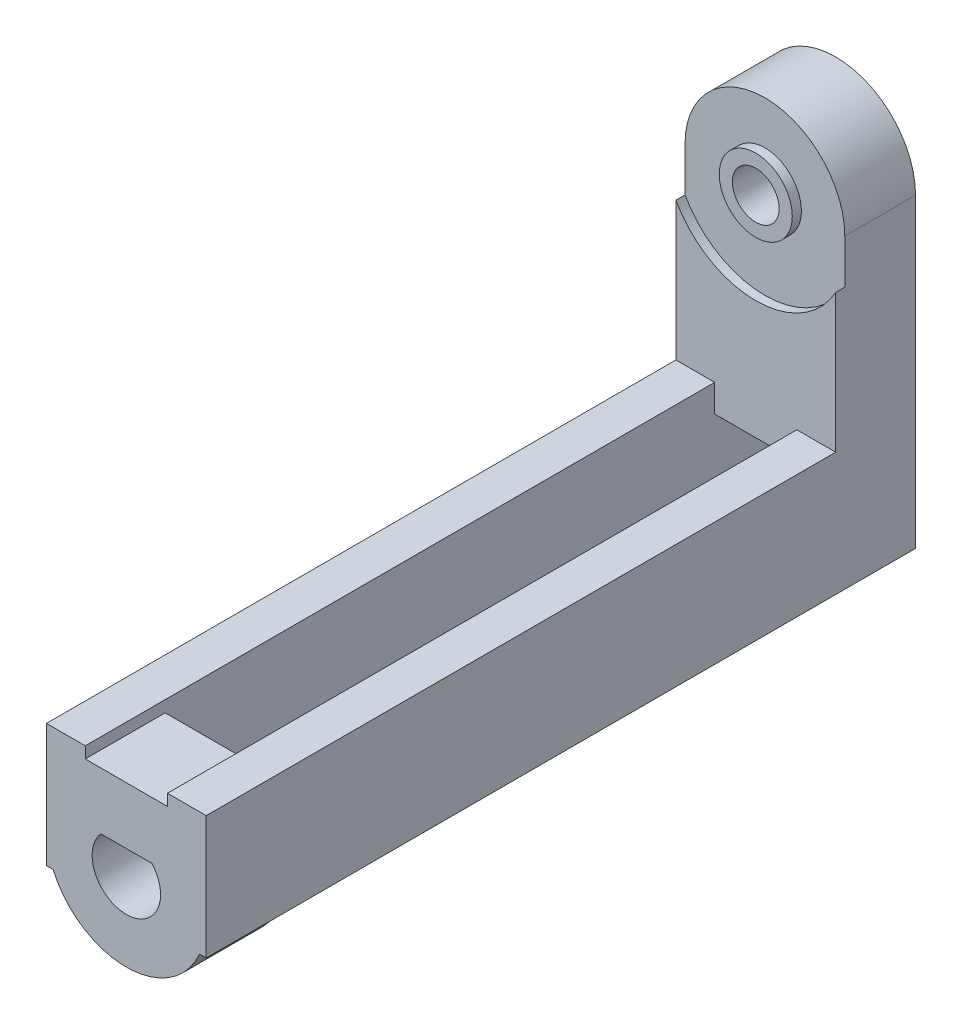
ISO-10303-21;
HEADER;
FILE_DESCRIPTION(('STEP AP214'),'2;1');
FILE_NAME('part.step','',(''),(''),'','','');
FILE_SCHEMA(('AUTOMOTIVE_DESIGN { 1 0 10303 214 1 1 1 1 }'));
ENDSEC;
DATA;
#1=APPLICATION_CONTEXT('core data for automotive mechanical design processes');
#2=APPLICATION_PROTOCOL_DEFINITION('international standard','automotive_design',2000,#1);
#3=PRODUCT_CONTEXT('',#1,'mechanical');
#4=PRODUCT('Part','Part','',(#3));
#5=PRODUCT_RELATED_PRODUCT_CATEGORY('part','',(#4));
#6=PRODUCT_DEFINITION_FORMATION('','',#4);
#7=PRODUCT_DEFINITION_CONTEXT('part definition',#1,'design');
#8=PRODUCT_DEFINITION('design','',#6,#7);
#9=PRODUCT_DEFINITION_SHAPE('','',#8);
#10=(LENGTH_UNIT() NAMED_UNIT(*) SI_UNIT(.MILLI.,.METRE.));
#11=(NAMED_UNIT(*) PLANE_ANGLE_UNIT() SI_UNIT($,.RADIAN.));
#12=(NAMED_UNIT(*) SI_UNIT($,.STERADIAN.) SOLID_ANGLE_UNIT());
#13=UNCERTAINTY_MEASURE_WITH_UNIT(LENGTH_MEASURE(1.E-05),#10,'distance_accuracy_value','');
#14=(GEOMETRIC_REPRESENTATION_CONTEXT(3) GLOBAL_UNCERTAINTY_ASSIGNED_CONTEXT((#13)) GLOBAL_UNIT_ASSIGNED_CONTEXT((#10,
#11,#12)) REPRESENTATION_CONTEXT('',''));
#15=CARTESIAN_POINT('',(0.,0.,0.));
#16=DIRECTION('',(0.,0.,1.));
#17=DIRECTION('',(1.,0.,0.));
#18=AXIS2_PLACEMENT_3D('',#15,#16,#17);
#19=CARTESIAN_POINT('',(0.,0.,-24.075));
#20=DIRECTION('',(0.,0.,-1.));
#21=DIRECTION('',(-1.,0.,0.));
#22=AXIS2_PLACEMENT_3D('',#19,#20,#21);
#23=PLANE('',#22);
#24=CARTESIAN_POINT('',(0.,12.,-24.075));
#25=DIRECTION('',(0.,0.,1.));
#26=DIRECTION('',(1.,0.,0.));
#27=AXIS2_PLACEMENT_3D('',#24,#25,#26);
#28=CIRCLE('',#27,4.);
#29=CARTESIAN_POINT('',(-3.5,10.0635083268963,-24.075));
#30=VERTEX_POINT('',#29);
#31=CARTESIAN_POINT('',(3.5,10.0635083268963,-24.075));
#32=VERTEX_POINT('',#31);
#33=EDGE_CURVE('E188',#30,#32,#28,.T.);
#34=ORIENTED_EDGE('',*,*,#33,.F.);
#35=DIRECTION('',(0.,-1.,0.));
#36=VECTOR('',#35,1.);
#37=CARTESIAN_POINT('',(-3.5,2.8,-24.075));
#38=LINE('',#37,#36);
#39=CARTESIAN_POINT('',(-3.5,4.,-24.075));
#40=VERTEX_POINT('',#39);
#41=EDGE_CURVE('E200',#30,#40,#38,.T.);
#42=ORIENTED_EDGE('',*,*,#41,.T.);
#43=DIRECTION('',(1.,0.,0.));
#44=VECTOR('',#43,1.);
#45=CARTESIAN_POINT('',(-3.5,4.,-24.075));
#46=LINE('',#45,#44);
#47=CARTESIAN_POINT('',(-1.8,4.,-24.075));
#48=VERTEX_POINT('',#47);
#49=EDGE_CURVE('E230',#40,#48,#46,.T.);
#50=ORIENTED_EDGE('',*,*,#49,.T.);
#51=DIRECTION('',(0.,-1.,0.));
#52=VECTOR('',#51,1.);
#53=CARTESIAN_POINT('',(-1.8,-1.4,-24.075));
#54=LINE('',#53,#52);
#55=CARTESIAN_POINT('',(-1.8,2.8,-24.075));
#56=VERTEX_POINT('',#55);
#57=EDGE_CURVE('E227',#48,#56,#54,.T.);
#58=ORIENTED_EDGE('',*,*,#57,.T.);
#59=DIRECTION('',(1.,0.,0.));
#60=VECTOR('',#59,1.);
#61=CARTESIAN_POINT('',(-3.5,2.8,-24.075));
#62=LINE('',#61,#60);
#63=CARTESIAN_POINT('',(1.8,2.8,-24.075));
#64=VERTEX_POINT('',#63);
#65=EDGE_CURVE('E209',#56,#64,#62,.T.);
#66=ORIENTED_EDGE('',*,*,#65,.T.);
#67=DIRECTION('',(0.,1.,0.));
#68=VECTOR('',#67,1.);
#69=CARTESIAN_POINT('',(1.8,-1.4,-24.075));
#70=LINE('',#69,#68);
#71=CARTESIAN_POINT('',(1.8,4.,-24.075));
#72=VERTEX_POINT('',#71);
#73=EDGE_CURVE('E224',#64,#72,#70,.T.);
#74=ORIENTED_EDGE('',*,*,#73,.T.);
#75=DIRECTION('',(1.,0.,0.));
#76=VECTOR('',#75,1.);
#77=CARTESIAN_POINT('',(1.8,4.,-24.075));
#78=LINE('',#77,#76);
#79=CARTESIAN_POINT('',(3.5,4.,-24.075));
#80=VERTEX_POINT('',#79);
#81=EDGE_CURVE('E338',#72,#80,#78,.T.);
#82=ORIENTED_EDGE('',*,*,#81,.T.);
#83=DIRECTION('',(0.,1.,0.));
#84=VECTOR('',#83,1.);
#85=CARTESIAN_POINT('',(3.5,2.8,-24.075));
#86=LINE('',#85,#84);
#87=EDGE_CURVE('E201',#80,#32,#86,.T.);
#88=ORIENTED_EDGE('',*,*,#87,.T.);
#89=EDGE_LOOP('',(#34,#42,#50,#58,#66,#74,#82,#88));
#90=FACE_BOUND('',#89,.T.);
#91=ADVANCED_FACE('F39',(#90),#23,.F.);
#92=CARTESIAN_POINT('',(0.,12.,-24.075));
#93=DIRECTION('',(0.,0.,1.));
#94=DIRECTION('',(1.,0.,0.));
#95=AXIS2_PLACEMENT_3D('',#92,#93,#94);
#96=CIRCLE('',#95,1.025);
#97=CARTESIAN_POINT('',(1.025,12.,-24.075));
#98=VERTEX_POINT('',#97);
#99=EDGE_CURVE('E473',#98,#98,#96,.T.);
#100=ORIENTED_EDGE('',*,*,#99,.F.);
#101=EDGE_LOOP('',(#100));
#102=FACE_BOUND('',#101,.T.);
#103=CARTESIAN_POINT('',(0.,12.,-24.075));
#104=DIRECTION('',(0.,0.,1.));
#105=DIRECTION('',(1.,0.,0.));
#106=AXIS2_PLACEMENT_3D('',#103,#104,#105);
#107=CIRCLE('',#106,1.6);
#108=CARTESIAN_POINT('',(1.6,12.,-24.075));
#109=VERTEX_POINT('',#108);
#110=EDGE_CURVE('E480',#109,#109,#107,.T.);
#111=ORIENTED_EDGE('',*,*,#110,.T.);
#112=EDGE_LOOP('',(#111));
#113=FACE_BOUND('',#112,.T.);
#114=ADVANCED_FACE('F401',(#102,#113),#23,.F.);
#115=CARTESIAN_POINT('',(0.,12.,-24.075));
#116=DIRECTION('',(0.,0.,-1.));
#117=DIRECTION('',(-1.,0.,0.));
#118=AXIS2_PLACEMENT_3D('',#115,#116,#117);
#119=CYLINDRICAL_SURFACE('',#118,3.5);
#120=CARTESIAN_POINT('',(0.,12.,-24.475));
#121=DIRECTION('',(0.,0.,1.));
#122=DIRECTION('',(1.,0.,0.));
#123=AXIS2_PLACEMENT_3D('',#120,#121,#122);
#124=CIRCLE('',#123,3.5);
#125=CARTESIAN_POINT('',(3.5,12.,-24.475));
#126=VERTEX_POINT('',#125);
#127=CARTESIAN_POINT('',(-3.5,12.,-24.475));
#128=VERTEX_POINT('',#127);
#129=EDGE_CURVE('E11',#126,#128,#124,.T.);
#130=ORIENTED_EDGE('',*,*,#129,.F.);
#131=DIRECTION('',(0.,0.,-1.));
#132=VECTOR('',#131,1.);
#133=CARTESIAN_POINT('',(3.5,12.,-24.075));
#134=LINE('',#133,#132);
#135=CARTESIAN_POINT('',(3.5,12.,-27.575));
#136=VERTEX_POINT('',#135);
#137=EDGE_CURVE('E225',#126,#136,#134,.T.);
#138=ORIENTED_EDGE('',*,*,#137,.T.);
#139=CARTESIAN_POINT('',(0.,12.,-27.575));
#140=DIRECTION('',(0.,0.,1.));
#141=DIRECTION('',(1.,0.,0.));
#142=AXIS2_PLACEMENT_3D('',#139,#140,#141);
#143=CIRCLE('',#142,3.5);
#144=CARTESIAN_POINT('',(-3.5,12.,-27.575));
#145=VERTEX_POINT('',#144);
#146=EDGE_CURVE('E211',#136,#145,#143,.T.);
#147=ORIENTED_EDGE('',*,*,#146,.T.);
#148=DIRECTION('',(0.,0.,-1.));
#149=VECTOR('',#148,1.);
#150=CARTESIAN_POINT('',(-3.5,12.,-24.075));
#151=LINE('',#150,#149);
#152=EDGE_CURVE('E219',#128,#145,#151,.T.);
#153=ORIENTED_EDGE('',*,*,#152,.F.);
#154=EDGE_LOOP('',(#130,#138,#147,#153));
#155=FACE_BOUND('',#154,.T.);
#156=ADVANCED_FACE('F386',(#155),#119,.T.);
#157=CARTESIAN_POINT('',(-1.8,-1.4,3.5));
#158=DIRECTION('',(-1.,0.,0.));
#159=DIRECTION('',(0.,0.,1.));
#160=AXIS2_PLACEMENT_3D('',#157,#158,#159);
#161=PLANE('',#160);
#162=DIRECTION('',(0.,0.,-1.));
#163=VECTOR('',#162,1.);
#164=CARTESIAN_POINT('',(-1.8,2.8,3.5));
#165=LINE('',#164,#163);
#166=CARTESIAN_POINT('',(-1.8,2.8,-27.575));
#167=VERTEX_POINT('',#166);
#168=EDGE_CURVE('E235',#56,#167,#165,.T.);
#169=ORIENTED_EDGE('',*,*,#168,.F.);
#170=ORIENTED_EDGE('',*,*,#57,.F.);
#171=DIRECTION('',(0.,0.,-1.));
#172=VECTOR('',#171,1.);
#173=CARTESIAN_POINT('',(-1.8,4.,3.5));
#174=LINE('',#173,#172);
#175=CARTESIAN_POINT('',(-1.8,4.,3.5));
#176=VERTEX_POINT('',#175);
#177=EDGE_CURVE('E286',#176,#48,#174,.T.);
#178=ORIENTED_EDGE('',*,*,#177,.F.);
#179=DIRECTION('',(0.,1.,0.));
#180=VECTOR('',#179,1.);
#181=CARTESIAN_POINT('',(-1.8,-1.4,3.5));
#182=LINE('',#181,#180);
#183=CARTESIAN_POINT('',(-1.8,3.5,3.5));
#184=VERTEX_POINT('',#183);
#185=EDGE_CURVE('E277',#184,#176,#182,.T.);
#186=ORIENTED_EDGE('',*,*,#185,.F.);
#187=DIRECTION('',(0.,0.,-1.));
#188=VECTOR('',#187,1.);
#189=CARTESIAN_POINT('',(-1.8,3.5,-1.2E-05));
#190=LINE('',#189,#188);
#191=CARTESIAN_POINT('',(-1.8,3.5,0.));
#192=VERTEX_POINT('',#191);
#193=EDGE_CURVE('E329',#184,#192,#190,.T.);
#194=ORIENTED_EDGE('',*,*,#193,.T.);
#195=DIRECTION('',(0.,-1.,0.));
#196=VECTOR('',#195,1.);
#197=CARTESIAN_POINT('',(-1.8,12.,0.));
#198=LINE('',#197,#196);
#199=CARTESIAN_POINT('',(-1.8,-1.4,0.));
#200=VERTEX_POINT('',#199);
#201=EDGE_CURVE('E298',#192,#200,#198,.T.);
#202=ORIENTED_EDGE('',*,*,#201,.T.);
#203=DIRECTION('',(0.,0.,-1.));
#204=VECTOR('',#203,1.);
#205=CARTESIAN_POINT('',(-1.8,-1.4,3.5));
#206=LINE('',#205,#204);
#207=CARTESIAN_POINT('',(-1.8,-1.4,-27.575));
#208=VERTEX_POINT('',#207);
#209=EDGE_CURVE('E292',#200,#208,#206,.T.);
#210=ORIENTED_EDGE('',*,*,#209,.T.);
#211=DIRECTION('',(0.,1.,0.));
#212=VECTOR('',#211,1.);
#213=CARTESIAN_POINT('',(-1.8,-1.4,-27.575));
#214=LINE('',#213,#212);
#215=EDGE_CURVE('E274',#208,#167,#214,.T.);
#216=ORIENTED_EDGE('',*,*,#215,.T.);
#217=EDGE_LOOP('',(#169,#170,#178,#186,#194,#202,#210,#216));
#218=FACE_BOUND('',#217,.T.);
#219=ADVANCED_FACE('F397',(#218),#161,.F.);
#220=CARTESIAN_POINT('',(-3.5,4.,3.5));
#221=DIRECTION('',(0.,-1.,0.));
#222=DIRECTION('',(0.,0.,-1.));
#223=AXIS2_PLACEMENT_3D('',#220,#221,#222);
#224=PLANE('',#223);
#225=ORIENTED_EDGE('',*,*,#49,.F.);
#226=DIRECTION('',(0.,0.,-1.));
#227=VECTOR('',#226,1.);
#228=CARTESIAN_POINT('',(-3.5,4.,3.5));
#229=LINE('',#228,#227);
#230=CARTESIAN_POINT('',(-3.5,4.,3.5));
#231=VERTEX_POINT('',#230);
#232=EDGE_CURVE('E210',#231,#40,#229,.T.);
#233=ORIENTED_EDGE('',*,*,#232,.F.);
#234=DIRECTION('',(-1.,0.,0.));
#235=VECTOR('',#234,1.);
#236=CARTESIAN_POINT('',(-3.5,4.,3.5));
#237=LINE('',#236,#235);
#238=EDGE_CURVE('E279',#176,#231,#237,.T.);
#239=ORIENTED_EDGE('',*,*,#238,.F.);
#240=ORIENTED_EDGE('',*,*,#177,.T.);
#241=EDGE_LOOP('',(#225,#233,#239,#240));
#242=FACE_BOUND('',#241,.T.);
#243=ADVANCED_FACE('F358',(#242),#224,.F.);
#244=CARTESIAN_POINT('',(1.8,-1.4,3.5));
#245=DIRECTION('',(1.,0.,0.));
#246=DIRECTION('',(0.,0.,-1.));
#247=AXIS2_PLACEMENT_3D('',#244,#245,#246);
#248=PLANE('',#247);
#249=DIRECTION('',(0.,0.,1.));
#250=VECTOR('',#249,1.);
#251=CARTESIAN_POINT('',(1.8,2.8,3.5));
#252=LINE('',#251,#250);
#253=CARTESIAN_POINT('',(1.8,2.8,-27.575));
#254=VERTEX_POINT('',#253);
#255=EDGE_CURVE('E50',#254,#64,#252,.T.);
#256=ORIENTED_EDGE('',*,*,#255,.F.);
#257=DIRECTION('',(0.,-1.,0.));
#258=VECTOR('',#257,1.);
#259=CARTESIAN_POINT('',(1.8,-1.4,-27.575));
#260=LINE('',#259,#258);
#261=CARTESIAN_POINT('',(1.8,-1.4,-27.575));
#262=VERTEX_POINT('',#261);
#263=EDGE_CURVE('E233',#254,#262,#260,.T.);
#264=ORIENTED_EDGE('',*,*,#263,.T.);
#265=DIRECTION('',(0.,0.,-1.));
#266=VECTOR('',#265,1.);
#267=CARTESIAN_POINT('',(1.8,-1.4,3.5));
#268=LINE('',#267,#266);
#269=CARTESIAN_POINT('',(1.8,-1.4,0.));
#270=VERTEX_POINT('',#269);
#271=EDGE_CURVE('E259',#270,#262,#268,.T.);
#272=ORIENTED_EDGE('',*,*,#271,.F.);
#273=DIRECTION('',(0.,1.,0.));
#274=VECTOR('',#273,1.);
#275=CARTESIAN_POINT('',(1.8,12.,0.));
#276=LINE('',#275,#274);
#277=CARTESIAN_POINT('',(1.8,3.5,0.));
#278=VERTEX_POINT('',#277);
#279=EDGE_CURVE('E267',#270,#278,#276,.T.);
#280=ORIENTED_EDGE('',*,*,#279,.T.);
#281=DIRECTION('',(0.,0.,1.));
#282=VECTOR('',#281,1.);
#283=CARTESIAN_POINT('',(1.8,3.5,-1.2E-05));
#284=LINE('',#283,#282);
#285=CARTESIAN_POINT('',(1.8,3.5,3.5));
#286=VERTEX_POINT('',#285);
#287=EDGE_CURVE('E270',#278,#286,#284,.T.);
#288=ORIENTED_EDGE('',*,*,#287,.T.);
#289=DIRECTION('',(0.,-1.,0.));
#290=VECTOR('',#289,1.);
#291=CARTESIAN_POINT('',(1.8,-1.4,3.5));
#292=LINE('',#291,#290);
#293=CARTESIAN_POINT('',(1.8,4.,3.5));
#294=VERTEX_POINT('',#293);
#295=EDGE_CURVE('E237',#294,#286,#292,.T.);
#296=ORIENTED_EDGE('',*,*,#295,.F.);
#297=DIRECTION('',(0.,0.,-1.));
#298=VECTOR('',#297,1.);
#299=CARTESIAN_POINT('',(1.8,4.,3.5));
#300=LINE('',#299,#298);
#301=EDGE_CURVE('E250',#294,#72,#300,.T.);
#302=ORIENTED_EDGE('',*,*,#301,.T.);
#303=ORIENTED_EDGE('',*,*,#73,.F.);
#304=EDGE_LOOP('',(#256,#264,#272,#280,#288,#296,#302,#303));
#305=FACE_BOUND('',#304,.T.);
#306=ADVANCED_FACE('F359',(#305),#248,.F.);
#307=CARTESIAN_POINT('',(1.8,4.,3.5));
#308=DIRECTION('',(0.,-1.,0.));
#309=DIRECTION('',(0.,0.,-1.));
#310=AXIS2_PLACEMENT_3D('',#307,#308,#309);
#311=PLANE('',#310);
#312=ORIENTED_EDGE('',*,*,#81,.F.);
#313=ORIENTED_EDGE('',*,*,#301,.F.);
#314=DIRECTION('',(-1.,0.,0.));
#315=VECTOR('',#314,1.);
#316=CARTESIAN_POINT('',(1.8,4.,3.5));
#317=LINE('',#316,#315);
#318=CARTESIAN_POINT('',(3.5,4.,3.5));
#319=VERTEX_POINT('',#318);
#320=EDGE_CURVE('E241',#319,#294,#317,.T.);
#321=ORIENTED_EDGE('',*,*,#320,.F.);
#322=DIRECTION('',(0.,0.,-1.));
#323=VECTOR('',#322,1.);
#324=CARTESIAN_POINT('',(3.5,4.,3.5));
#325=LINE('',#324,#323);
#326=EDGE_CURVE('E254',#319,#80,#325,.T.);
#327=ORIENTED_EDGE('',*,*,#326,.T.);
#328=EDGE_LOOP('',(#312,#313,#321,#327));
#329=FACE_BOUND('',#328,.T.);
#330=ADVANCED_FACE('F410',(#329),#311,.F.);
#331=CARTESIAN_POINT('',(0.,0.,3.5));
#332=DIRECTION('',(0.,0.,-1.));
#333=DIRECTION('',(-1.,0.,0.));
#334=AXIS2_PLACEMENT_3D('',#331,#332,#333);
#335=CYLINDRICAL_SURFACE('',#334,3.5);
#336=DIRECTION('',(0.,0.,-1.));
#337=VECTOR('',#336,1.);
#338=CARTESIAN_POINT('',(3.20780298646909,-1.4,3.5));
#339=LINE('',#338,#337);
#340=CARTESIAN_POINT('',(3.20780298646909,-1.4,3.5));
#341=VERTEX_POINT('',#340);
#342=CARTESIAN_POINT('',(3.20780298646909,-1.4,0.));
#343=VERTEX_POINT('',#342);
#344=EDGE_CURVE('E262',#341,#343,#339,.T.);
#345=ORIENTED_EDGE('',*,*,#344,.F.);
#346=CARTESIAN_POINT('',(0.,0.,3.5));
#347=DIRECTION('',(0.,0.,1.));
#348=DIRECTION('',(1.,0.,0.));
#349=AXIS2_PLACEMENT_3D('',#346,#347,#348);
#350=CIRCLE('',#349,3.5);
#351=CARTESIAN_POINT('',(-3.20780298646909,-1.4,3.5));
#352=VERTEX_POINT('',#351);
#353=EDGE_CURVE('E325',#352,#341,#350,.T.);
#354=ORIENTED_EDGE('',*,*,#353,.F.);
#355=DIRECTION('',(0.,0.,-1.));
#356=VECTOR('',#355,1.);
#357=CARTESIAN_POINT('',(-3.20780298646909,-1.4,3.5));
#358=LINE('',#357,#356);
#359=CARTESIAN_POINT('',(-3.20780298646909,-1.4,0.));
#360=VERTEX_POINT('',#359);
#361=EDGE_CURVE('E299',#360,#352,#358,.F.);
#362=ORIENTED_EDGE('',*,*,#361,.F.);
#363=CARTESIAN_POINT('',(0.,0.,0.));
#364=DIRECTION('',(0.,0.,1.));
#365=DIRECTION('',(1.,0.,0.));
#366=AXIS2_PLACEMENT_3D('',#363,#364,#365);
#367=CIRCLE('',#366,3.5);
#368=EDGE_CURVE('E320',#360,#343,#367,.T.);
#369=ORIENTED_EDGE('',*,*,#368,.T.);
#370=EDGE_LOOP('',(#345,#354,#362,#369));
#371=FACE_BOUND('',#370,.T.);
#372=ADVANCED_FACE('F41',(#371),#335,.T.);
#373=CARTESIAN_POINT('',(0.,12.,0.));
#374=DIRECTION('',(0.,0.,1.));
#375=DIRECTION('',(1.,0.,0.));
#376=AXIS2_PLACEMENT_3D('',#373,#374,#375);
#377=PLANE('',#376);
#378=DIRECTION('',(-1.,0.,0.));
#379=VECTOR('',#378,1.);
#380=CARTESIAN_POINT('',(-1.1180339887499,1.,0.));
#381=LINE('',#380,#379);
#382=CARTESIAN_POINT('',(1.1180339887499,1.,0.));
#383=VERTEX_POINT('',#382);
#384=CARTESIAN_POINT('',(-1.1180339887499,0.999999999999999,0.));
#385=VERTEX_POINT('',#384);
#386=EDGE_CURVE('E309',#383,#385,#381,.T.);
#387=ORIENTED_EDGE('',*,*,#386,.T.);
#388=CARTESIAN_POINT('',(0.,0.,0.));
#389=DIRECTION('',(0.,0.,1.));
#390=DIRECTION('',(1.,0.,0.));
#391=AXIS2_PLACEMENT_3D('',#388,#389,#390);
#392=CIRCLE('',#391,1.5);
#393=EDGE_CURVE('E313',#385,#383,#392,.T.);
#394=ORIENTED_EDGE('',*,*,#393,.T.);
#395=EDGE_LOOP('',(#387,#394));
#396=FACE_BOUND('',#395,.T.);
#397=ORIENTED_EDGE('',*,*,#279,.F.);
#398=DIRECTION('',(-1.,0.,0.));
#399=VECTOR('',#398,1.);
#400=CARTESIAN_POINT('',(0.,-1.4,0.));
#401=LINE('',#400,#399);
#402=EDGE_CURVE('E261',#343,#270,#401,.T.);
#403=ORIENTED_EDGE('',*,*,#402,.F.);
#404=ORIENTED_EDGE('',*,*,#368,.F.);
#405=DIRECTION('',(-1.,0.,0.));
#406=VECTOR('',#405,1.);
#407=CARTESIAN_POINT('',(0.,-1.4,0.));
#408=LINE('',#407,#406);
#409=EDGE_CURVE('E331',#200,#360,#408,.T.);
#410=ORIENTED_EDGE('',*,*,#409,.F.);
#411=ORIENTED_EDGE('',*,*,#201,.F.);
#412=DIRECTION('',(1.,0.,0.));
#413=VECTOR('',#412,1.);
#414=CARTESIAN_POINT('',(0.,3.5,0.));
#415=LINE('',#414,#413);
#416=EDGE_CURVE('E322',#192,#278,#415,.T.);
#417=ORIENTED_EDGE('',*,*,#416,.T.);
#418=EDGE_LOOP('',(#397,#403,#404,#410,#411,#417));
#419=FACE_BOUND('',#418,.T.);
#420=ADVANCED_FACE('F450',(#396,#419),#377,.F.);
#421=CARTESIAN_POINT('',(-5.,3.5,-1.2E-05));
#422=DIRECTION('',(0.,-1.,0.));
#423=DIRECTION('',(0.,0.,-1.));
#424=AXIS2_PLACEMENT_3D('',#421,#422,#423);
#425=PLANE('',#424);
#426=ORIENTED_EDGE('',*,*,#287,.F.);
#427=ORIENTED_EDGE('',*,*,#416,.F.);
#428=ORIENTED_EDGE('',*,*,#193,.F.);
#429=DIRECTION('',(1.,0.,0.));
#430=VECTOR('',#429,1.);
#431=CARTESIAN_POINT('',(-5.,3.5,3.5));
#432=LINE('',#431,#430);
#433=EDGE_CURVE('E305',#184,#286,#432,.T.);
#434=ORIENTED_EDGE('',*,*,#433,.T.);
#435=EDGE_LOOP('',(#426,#427,#428,#434));
#436=FACE_BOUND('',#435,.T.);
#437=ADVANCED_FACE('F465',(#436),#425,.F.);
#438=CARTESIAN_POINT('',(0.,12.,3.5));
#439=DIRECTION('',(0.,0.,1.));
#440=DIRECTION('',(1.,0.,0.));
#441=AXIS2_PLACEMENT_3D('',#438,#439,#440);
#442=PLANE('',#441);
#443=ORIENTED_EDGE('',*,*,#295,.T.);
#444=ORIENTED_EDGE('',*,*,#433,.F.);
#445=ORIENTED_EDGE('',*,*,#185,.T.);
#446=ORIENTED_EDGE('',*,*,#238,.T.);
#447=DIRECTION('',(0.,-1.,0.));
#448=VECTOR('',#447,1.);
#449=CARTESIAN_POINT('',(-3.5,-1.4,3.5));
#450=LINE('',#449,#448);
#451=CARTESIAN_POINT('',(-3.5,-1.4,3.5));
#452=VERTEX_POINT('',#451);
#453=EDGE_CURVE('E275',#231,#452,#450,.T.);
#454=ORIENTED_EDGE('',*,*,#453,.T.);
#455=DIRECTION('',(1.,0.,0.));
#456=VECTOR('',#455,1.);
#457=CARTESIAN_POINT('',(-3.5,-1.4,3.5));
#458=LINE('',#457,#456);
#459=EDGE_CURVE('E272',#452,#352,#458,.T.);
#460=ORIENTED_EDGE('',*,*,#459,.T.);
#461=ORIENTED_EDGE('',*,*,#353,.T.);
#462=DIRECTION('',(1.,0.,0.));
#463=VECTOR('',#462,1.);
#464=CARTESIAN_POINT('',(1.8,-1.4,3.5));
#465=LINE('',#464,#463);
#466=CARTESIAN_POINT('',(3.5,-1.4,3.5));
#467=VERTEX_POINT('',#466);
#468=EDGE_CURVE('E236',#341,#467,#465,.T.);
#469=ORIENTED_EDGE('',*,*,#468,.T.);
#470=DIRECTION('',(0.,1.,0.));
#471=VECTOR('',#470,1.);
#472=CARTESIAN_POINT('',(3.5,-1.4,3.5));
#473=LINE('',#472,#471);
#474=EDGE_CURVE('E243',#467,#319,#473,.T.);
#475=ORIENTED_EDGE('',*,*,#474,.T.);
#476=ORIENTED_EDGE('',*,*,#320,.T.);
#477=EDGE_LOOP('',(#443,#444,#445,#446,#454,#460,#461,#469,#475,#476));
#478=FACE_BOUND('',#477,.T.);
#479=CARTESIAN_POINT('',(0.,0.,3.5));
#480=DIRECTION('',(0.,0.,1.));
#481=DIRECTION('',(1.,0.,0.));
#482=AXIS2_PLACEMENT_3D('',#479,#480,#481);
#483=CIRCLE('',#482,1.5);
#484=CARTESIAN_POINT('',(-1.1180339887499,1.,3.5));
#485=VERTEX_POINT('',#484);
#486=CARTESIAN_POINT('',(1.1180339887499,0.999999999999999,3.5));
#487=VERTEX_POINT('',#486);
#488=EDGE_CURVE('E311',#485,#487,#483,.T.);
#489=ORIENTED_EDGE('',*,*,#488,.F.);
#490=DIRECTION('',(-1.,0.,0.));
#491=VECTOR('',#490,1.);
#492=CARTESIAN_POINT('',(-1.1180339887499,1.,3.5));
#493=LINE('',#492,#491);
#494=EDGE_CURVE('E312',#487,#485,#493,.T.);
#495=ORIENTED_EDGE('',*,*,#494,.F.);
#496=EDGE_LOOP('',(#489,#495));
#497=FACE_BOUND('',#496,.T.);
#498=ADVANCED_FACE('F430',(#478,#497),#442,.T.);
#499=CARTESIAN_POINT('',(0.,0.,0.));
#500=DIRECTION('',(0.,0.,1.));
#501=DIRECTION('',(1.,0.,0.));
#502=AXIS2_PLACEMENT_3D('',#499,#500,#501);
#503=CYLINDRICAL_SURFACE('',#502,1.5);
#504=ORIENTED_EDGE('',*,*,#488,.T.);
#505=DIRECTION('',(0.,0.,1.));
#506=VECTOR('',#505,1.);
#507=CARTESIAN_POINT('',(1.1180339887499,1.,0.));
#508=LINE('',#507,#506);
#509=EDGE_CURVE('E307',#383,#487,#508,.T.);
#510=ORIENTED_EDGE('',*,*,#509,.F.);
#511=ORIENTED_EDGE('',*,*,#393,.F.);
#512=DIRECTION('',(0.,0.,1.));
#513=VECTOR('',#512,1.);
#514=CARTESIAN_POINT('',(-1.1180339887499,1.,0.));
#515=LINE('',#514,#513);
#516=EDGE_CURVE('E304',#385,#485,#515,.T.);
#517=ORIENTED_EDGE('',*,*,#516,.T.);
#518=EDGE_LOOP('',(#504,#510,#511,#517));
#519=FACE_BOUND('',#518,.T.);
#520=ADVANCED_FACE('F610',(#519),#503,.F.);
#521=CARTESIAN_POINT('',(-1.1180339887499,1.,0.));
#522=DIRECTION('',(0.,1.,0.));
#523=DIRECTION('',(0.,0.,1.));
#524=AXIS2_PLACEMENT_3D('',#521,#522,#523);
#525=PLANE('',#524);
#526=ORIENTED_EDGE('',*,*,#494,.T.);
#527=ORIENTED_EDGE('',*,*,#516,.F.);
#528=ORIENTED_EDGE('',*,*,#386,.F.);
#529=ORIENTED_EDGE('',*,*,#509,.T.);
#530=EDGE_LOOP('',(#526,#527,#528,#529));
#531=FACE_BOUND('',#530,.T.);
#532=ADVANCED_FACE('F628',(#531),#525,.F.);
#533=CARTESIAN_POINT('',(-3.5,-1.4,3.5));
#534=DIRECTION('',(0.,1.,0.));
#535=DIRECTION('',(0.,0.,1.));
#536=AXIS2_PLACEMENT_3D('',#533,#534,#535);
#537=PLANE('',#536);
#538=ORIENTED_EDGE('',*,*,#409,.T.);
#539=ORIENTED_EDGE('',*,*,#361,.T.);
#540=ORIENTED_EDGE('',*,*,#459,.F.);
#541=DIRECTION('',(0.,0.,-1.));
#542=VECTOR('',#541,1.);
#543=CARTESIAN_POINT('',(-3.5,-1.4,3.5));
#544=LINE('',#543,#542);
#545=CARTESIAN_POINT('',(-3.5,-1.4,-27.575));
#546=VERTEX_POINT('',#545);
#547=EDGE_CURVE('E293',#452,#546,#544,.T.);
#548=ORIENTED_EDGE('',*,*,#547,.T.);
#549=DIRECTION('',(1.,0.,0.));
#550=VECTOR('',#549,1.);
#551=CARTESIAN_POINT('',(-3.5,-1.4,-27.575));
#552=LINE('',#551,#550);
#553=EDGE_CURVE('E281',#546,#208,#552,.T.);
#554=ORIENTED_EDGE('',*,*,#553,.T.);
#555=ORIENTED_EDGE('',*,*,#209,.F.);
#556=EDGE_LOOP('',(#538,#539,#540,#548,#554,#555));
#557=FACE_BOUND('',#556,.T.);
#558=ADVANCED_FACE('F435',(#557),#537,.F.);
#559=CARTESIAN_POINT('',(-3.5,-1.4,3.5));
#560=DIRECTION('',(1.,0.,0.));
#561=DIRECTION('',(0.,0.,-1.));
#562=AXIS2_PLACEMENT_3D('',#559,#560,#561);
#563=PLANE('',#562);
#564=ORIENTED_EDGE('',*,*,#41,.F.);
#565=DIRECTION('',(0.,0.,1.));
#566=VECTOR('',#565,1.);
#567=CARTESIAN_POINT('',(-3.5,10.0635083268963,-24.475));
#568=LINE('',#567,#566);
#569=CARTESIAN_POINT('',(-3.5,10.0635083268963,-24.475));
#570=VERTEX_POINT('',#569);
#571=EDGE_CURVE('E181',#30,#570,#568,.F.);
#572=ORIENTED_EDGE('',*,*,#571,.T.);
#573=DIRECTION('',(0.,-1.,0.));
#574=VECTOR('',#573,1.);
#575=CARTESIAN_POINT('',(-3.5,-1.4,-24.475));
#576=LINE('',#575,#574);
#577=EDGE_CURVE('E470',#128,#570,#576,.T.);
#578=ORIENTED_EDGE('',*,*,#577,.F.);
#579=ORIENTED_EDGE('',*,*,#152,.T.);
#580=DIRECTION('',(0.,-1.,0.));
#581=VECTOR('',#580,1.);
#582=CARTESIAN_POINT('',(-3.5,-1.4,-27.575));
#583=LINE('',#582,#581);
#584=EDGE_CURVE('E271',#145,#546,#583,.T.);
#585=ORIENTED_EDGE('',*,*,#584,.T.);
#586=ORIENTED_EDGE('',*,*,#547,.F.);
#587=ORIENTED_EDGE('',*,*,#453,.F.);
#588=ORIENTED_EDGE('',*,*,#232,.T.);
#589=EDGE_LOOP('',(#564,#572,#578,#579,#585,#586,#587,#588));
#590=FACE_BOUND('',#589,.T.);
#591=ADVANCED_FACE('F204',(#590),#563,.F.);
#592=CARTESIAN_POINT('',(0.,0.,-27.575));
#593=DIRECTION('',(0.,0.,-1.));
#594=DIRECTION('',(-1.,0.,0.));
#595=AXIS2_PLACEMENT_3D('',#592,#593,#594);
#596=PLANE('',#595);
#597=CARTESIAN_POINT('',(-1.025,12.,-27.575));
#598=CARTESIAN_POINT('',(-1.025,11.5749920798942,-27.575));
#599=CARTESIAN_POINT('',(-0.724784450716211,11.2752155492838,-27.575));
#600=CARTESIAN_POINT('',(-0.423818674387767,10.9746898887194,-27.575));
#601=CARTESIAN_POINT('',(0.,10.975,-27.575));
#602=CARTESIAN_POINT('',(0.425318673852856,10.9753112088414,-27.575));
#603=CARTESIAN_POINT('',(0.724784450716211,11.2752155492838,-27.575));
#604=CARTESIAN_POINT('',(1.025,11.5758707601782,-27.575));
#605=CARTESIAN_POINT('',(1.025,12.,-27.575));
#606=B_SPLINE_CURVE_WITH_KNOTS('',2,(#597,#598,#599,#600,#601,#602,#603,#604,#605),
.UNSPECIFIED.,.F.,.F.,(3,2,2,2,3),(0.,0.25,0.5,0.75,1.),.UNSPECIFIED.);
#607=CARTESIAN_POINT('',(-1.02500000002331,12.0000000637268,-27.5805));
#608=VERTEX_POINT('',#607);
#609=CARTESIAN_POINT('',(1.025,12.,-27.5805));
#610=VERTEX_POINT('',#609);
#611=EDGE_CURVE('E58',#608,#610,#606,.T.);
#612=ORIENTED_EDGE('',*,*,#611,.T.);
#613=CARTESIAN_POINT('',(1.025,12.,-27.575));
#614=CARTESIAN_POINT('',(1.025,12.4241292398218,-27.575));
#615=CARTESIAN_POINT('',(0.724784450716211,12.7247844507162,-27.575));
#616=CARTESIAN_POINT('',(0.425318673852855,13.0246887911586,-27.575));
#617=CARTESIAN_POINT('',(0.,13.025,-27.575));
#618=CARTESIAN_POINT('',(-0.423818674387552,13.0253101112806,-27.575));
#619=CARTESIAN_POINT('',(-0.724784450716211,12.7247844507162,-27.575));
#620=CARTESIAN_POINT('',(-1.025,12.425007920106,-27.575));
#621=CARTESIAN_POINT('',(-1.025,12.,-27.575));
#622=B_SPLINE_CURVE_WITH_KNOTS('',2,(#613,#614,#615,#616,#617,#618,#619,#620,#621),
.UNSPECIFIED.,.F.,.F.,(3,2,2,2,3),(0.,0.25,0.5,0.75,1.),.UNSPECIFIED.);
#623=EDGE_CURVE('E341',#610,#608,#622,.T.);
#624=ORIENTED_EDGE('',*,*,#623,.T.);
#625=EDGE_LOOP('',(#612,#624));
#626=FACE_BOUND('',#625,.T.);
#627=ORIENTED_EDGE('',*,*,#584,.F.);
#628=ORIENTED_EDGE('',*,*,#146,.F.);
#629=DIRECTION('',(0.,1.,0.));
#630=VECTOR('',#629,1.);
#631=CARTESIAN_POINT('',(3.5,-1.4,-27.575));
#632=LINE('',#631,#630);
#633=CARTESIAN_POINT('',(3.5,-1.4,-27.575));
#634=VERTEX_POINT('',#633);
#635=EDGE_CURVE('E238',#634,#136,#632,.T.);
#636=ORIENTED_EDGE('',*,*,#635,.F.);
#637=DIRECTION('',(1.,0.,0.));
#638=VECTOR('',#637,1.);
#639=CARTESIAN_POINT('',(1.8,-1.4,-27.575));
#640=LINE('',#639,#638);
#641=EDGE_CURVE('E249',#262,#634,#640,.T.);
#642=ORIENTED_EDGE('',*,*,#641,.F.);
#643=ORIENTED_EDGE('',*,*,#263,.F.);
#644=DIRECTION('',(1.,0.,0.));
#645=VECTOR('',#644,1.);
#646=CARTESIAN_POINT('',(-3.5,2.8,-27.575));
#647=LINE('',#646,#645);
#648=EDGE_CURVE('E206',#167,#254,#647,.T.);
#649=ORIENTED_EDGE('',*,*,#648,.F.);
#650=ORIENTED_EDGE('',*,*,#215,.F.);
#651=ORIENTED_EDGE('',*,*,#553,.F.);
#652=EDGE_LOOP('',(#627,#628,#636,#642,#643,#649,#650,#651));
#653=FACE_BOUND('',#652,.T.);
#654=ADVANCED_FACE('F350',(#626,#653),#596,.T.);
#655=CARTESIAN_POINT('',(1.8,-1.4,3.5));
#656=DIRECTION('',(0.,1.,0.));
#657=DIRECTION('',(0.,0.,1.));
#658=AXIS2_PLACEMENT_3D('',#655,#656,#657);
#659=PLANE('',#658);
#660=ORIENTED_EDGE('',*,*,#468,.F.);
#661=ORIENTED_EDGE('',*,*,#344,.T.);
#662=ORIENTED_EDGE('',*,*,#402,.T.);
#663=ORIENTED_EDGE('',*,*,#271,.T.);
#664=ORIENTED_EDGE('',*,*,#641,.T.);
#665=DIRECTION('',(0.,0.,-1.));
#666=VECTOR('',#665,1.);
#667=CARTESIAN_POINT('',(3.5,-1.4,3.5));
#668=LINE('',#667,#666);
#669=EDGE_CURVE('E257',#467,#634,#668,.T.);
#670=ORIENTED_EDGE('',*,*,#669,.F.);
#671=EDGE_LOOP('',(#660,#661,#662,#663,#664,#670));
#672=FACE_BOUND('',#671,.T.);
#673=ADVANCED_FACE('F360',(#672),#659,.F.);
#674=CARTESIAN_POINT('',(3.5,-1.4,3.5));
#675=DIRECTION('',(-1.,0.,0.));
#676=DIRECTION('',(0.,0.,1.));
#677=AXIS2_PLACEMENT_3D('',#674,#675,#676);
#678=PLANE('',#677);
#679=DIRECTION('',(0.,1.,0.));
#680=VECTOR('',#679,1.);
#681=CARTESIAN_POINT('',(3.5,-1.4,-24.475));
#682=LINE('',#681,#680);
#683=CARTESIAN_POINT('',(3.5,10.0635083268963,-24.475));
#684=VERTEX_POINT('',#683);
#685=EDGE_CURVE('E52',#684,#126,#682,.T.);
#686=ORIENTED_EDGE('',*,*,#685,.F.);
#687=DIRECTION('',(0.,0.,1.));
#688=VECTOR('',#687,1.);
#689=CARTESIAN_POINT('',(3.5,10.0635083268963,-24.475));
#690=LINE('',#689,#688);
#691=EDGE_CURVE('E195',#684,#32,#690,.T.);
#692=ORIENTED_EDGE('',*,*,#691,.T.);
#693=ORIENTED_EDGE('',*,*,#87,.F.);
#694=ORIENTED_EDGE('',*,*,#326,.F.);
#695=ORIENTED_EDGE('',*,*,#474,.F.);
#696=ORIENTED_EDGE('',*,*,#669,.T.);
#697=ORIENTED_EDGE('',*,*,#635,.T.);
#698=ORIENTED_EDGE('',*,*,#137,.F.);
#699=EDGE_LOOP('',(#686,#692,#693,#694,#695,#696,#697,#698));
#700=FACE_BOUND('',#699,.T.);
#701=ADVANCED_FACE('F407',(#700),#678,.F.);
#702=CARTESIAN_POINT('',(-3.5,2.8,-24.075));
#703=DIRECTION('',(0.,1.,0.));
#704=DIRECTION('',(0.,0.,1.));
#705=AXIS2_PLACEMENT_3D('',#702,#703,#704);
#706=PLANE('',#705);
#707=ORIENTED_EDGE('',*,*,#65,.F.);
#708=ORIENTED_EDGE('',*,*,#168,.T.);
#709=ORIENTED_EDGE('',*,*,#648,.T.);
#710=ORIENTED_EDGE('',*,*,#255,.T.);
#711=EDGE_LOOP('',(#707,#708,#709,#710));
#712=FACE_BOUND('',#711,.T.);
#713=ADVANCED_FACE('F387',(#712),#706,.F.);
#714=CARTESIAN_POINT('',(0.,12.,-24.075));
#715=DIRECTION('',(0.,0.,-1.));
#716=DIRECTION('',(-1.,0.,0.));
#717=AXIS2_PLACEMENT_3D('',#714,#715,#716);
#718=CYLINDRICAL_SURFACE('',#717,1.025);
#719=ORIENTED_EDGE('',*,*,#99,.T.);
#720=EDGE_LOOP('',(#719));
#721=FACE_BOUND('',#720,.T.);
#722=ORIENTED_EDGE('',*,*,#611,.F.);
#723=ORIENTED_EDGE('',*,*,#623,.F.);
#724=EDGE_LOOP('',(#722,#723));
#725=FACE_BOUND('',#724,.T.);
#726=ADVANCED_FACE('F376',(#721,#725),#718,.F.);
#727=CARTESIAN_POINT('',(0.,12.,-24.475));
#728=DIRECTION('',(0.,0.,1.));
#729=DIRECTION('',(1.,0.,0.));
#730=AXIS2_PLACEMENT_3D('',#727,#728,#729);
#731=CYLINDRICAL_SURFACE('',#730,4.);
#732=ORIENTED_EDGE('',*,*,#33,.T.);
#733=ORIENTED_EDGE('',*,*,#691,.F.);
#734=CARTESIAN_POINT('',(0.,12.,-24.475));
#735=DIRECTION('',(0.,0.,1.));
#736=DIRECTION('',(1.,0.,0.));
#737=AXIS2_PLACEMENT_3D('',#734,#735,#736);
#738=CIRCLE('',#737,4.);
#739=EDGE_CURVE('E186',#570,#684,#738,.T.);
#740=ORIENTED_EDGE('',*,*,#739,.F.);
#741=ORIENTED_EDGE('',*,*,#571,.F.);
#742=EDGE_LOOP('',(#732,#733,#740,#741));
#743=FACE_BOUND('',#742,.T.);
#744=ADVANCED_FACE('F184',(#743),#731,.F.);
#745=CARTESIAN_POINT('',(0.,12.,-24.475));
#746=DIRECTION('',(0.,0.,1.));
#747=DIRECTION('',(1.,0.,0.));
#748=AXIS2_PLACEMENT_3D('',#745,#746,#747);
#749=PLANE('',#748);
#750=CARTESIAN_POINT('',(0.,12.,-24.475));
#751=DIRECTION('',(0.,0.,1.));
#752=DIRECTION('',(1.,0.,0.));
#753=AXIS2_PLACEMENT_3D('',#750,#751,#752);
#754=CIRCLE('',#753,1.6);
#755=CARTESIAN_POINT('',(1.6,12.,-24.475));
#756=VERTEX_POINT('',#755);
#757=EDGE_CURVE('E205',#756,#756,#754,.T.);
#758=ORIENTED_EDGE('',*,*,#757,.F.);
#759=EDGE_LOOP('',(#758));
#760=FACE_BOUND('',#759,.T.);
#761=ORIENTED_EDGE('',*,*,#577,.T.);
#762=ORIENTED_EDGE('',*,*,#739,.T.);
#763=ORIENTED_EDGE('',*,*,#685,.T.);
#764=ORIENTED_EDGE('',*,*,#129,.T.);
#765=EDGE_LOOP('',(#761,#762,#763,#764));
#766=FACE_BOUND('',#765,.T.);
#767=ADVANCED_FACE('F474',(#760,#766),#749,.T.);
#768=CARTESIAN_POINT('',(0.,12.,-24.475));
#769=DIRECTION('',(0.,0.,1.));
#770=DIRECTION('',(1.,0.,0.));
#771=AXIS2_PLACEMENT_3D('',#768,#769,#770);
#772=CYLINDRICAL_SURFACE('',#771,1.6);
#773=ORIENTED_EDGE('',*,*,#757,.T.);
#774=EDGE_LOOP('',(#773));
#775=FACE_BOUND('',#774,.T.);
#776=ORIENTED_EDGE('',*,*,#110,.F.);
#777=EDGE_LOOP('',(#776));
#778=FACE_BOUND('',#777,.T.);
#779=ADVANCED_FACE('F481',(#775,#778),#772,.T.);
#780=CLOSED_SHELL('',(#91,#114,#156,#219,#243,#306,#330,#372,#420,#437,#498,#520,#532,#558,#591,
#654,#673,#701,#713,#726,#744,#767,#779));
#781=MANIFOLD_SOLID_BREP('B2',#780);
#782=ADVANCED_BREP_SHAPE_REPRESENTATION('',(#18,#781),#14);
#783=SHAPE_DEFINITION_REPRESENTATION(#9,#782);
ENDSEC;
END-ISO-10303-21;
